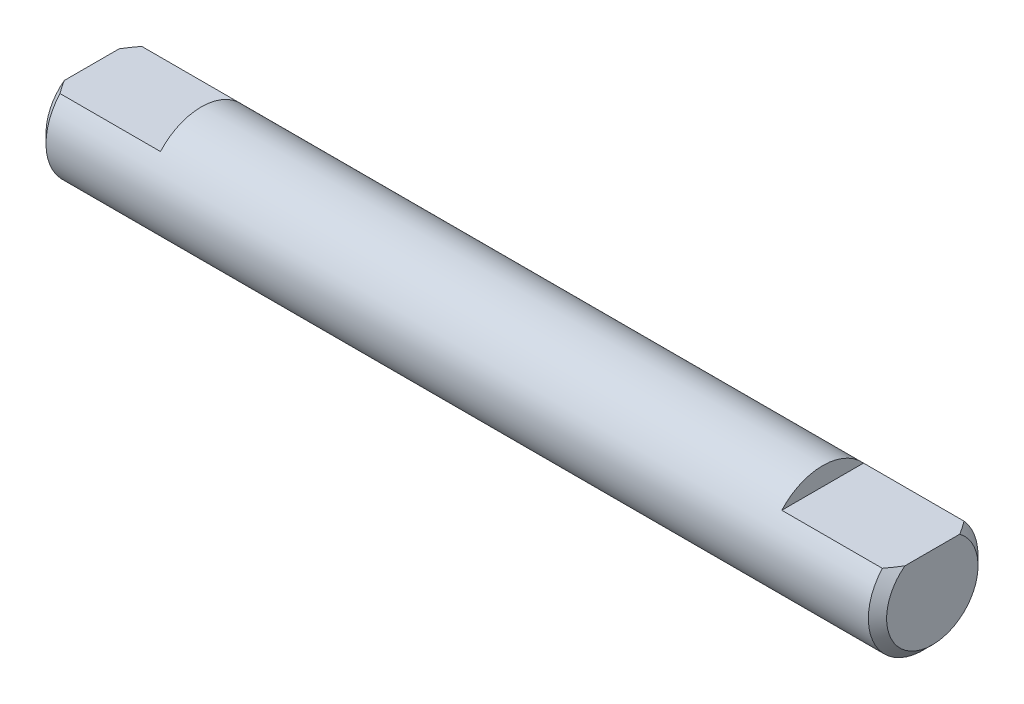
ISO-10303-21;
HEADER;
FILE_DESCRIPTION(('STEP AP214'),'2;1');
FILE_NAME('part.step','',(''),(''),'','','');
FILE_SCHEMA(('AUTOMOTIVE_DESIGN { 1 0 10303 214 1 1 1 1 }'));
ENDSEC;
DATA;
#1=APPLICATION_CONTEXT('core data for automotive mechanical design processes');
#2=APPLICATION_PROTOCOL_DEFINITION('international standard','automotive_design',2000,#1);
#3=PRODUCT_CONTEXT('',#1,'mechanical');
#4=PRODUCT('Part','Part','',(#3));
#5=PRODUCT_RELATED_PRODUCT_CATEGORY('part','',(#4));
#6=PRODUCT_DEFINITION_FORMATION('','',#4);
#7=PRODUCT_DEFINITION_CONTEXT('part definition',#1,'design');
#8=PRODUCT_DEFINITION('design','',#6,#7);
#9=PRODUCT_DEFINITION_SHAPE('','',#8);
#10=(LENGTH_UNIT() NAMED_UNIT(*) SI_UNIT(.MILLI.,.METRE.));
#11=(NAMED_UNIT(*) PLANE_ANGLE_UNIT() SI_UNIT($,.RADIAN.));
#12=(NAMED_UNIT(*) SI_UNIT($,.STERADIAN.) SOLID_ANGLE_UNIT());
#13=UNCERTAINTY_MEASURE_WITH_UNIT(LENGTH_MEASURE(1.E-05),#10,'distance_accuracy_value','');
#14=(GEOMETRIC_REPRESENTATION_CONTEXT(3) GLOBAL_UNCERTAINTY_ASSIGNED_CONTEXT((#13)) GLOBAL_UNIT_ASSIGNED_CONTEXT((#10,
#11,#12)) REPRESENTATION_CONTEXT('',''));
#15=CARTESIAN_POINT('',(0.,0.,0.));
#16=DIRECTION('',(0.,0.,1.));
#17=DIRECTION('',(1.,0.,0.));
#18=AXIS2_PLACEMENT_3D('',#15,#16,#17);
#19=CARTESIAN_POINT('',(23.,0.,0.));
#20=DIRECTION('',(-1.,0.,0.));
#21=DIRECTION('',(0.,0.,1.));
#22=AXIS2_PLACEMENT_3D('',#19,#20,#21);
#23=CYLINDRICAL_SURFACE('',#22,3.);
#24=CARTESIAN_POINT('',(22.5,0.,0.));
#25=DIRECTION('',(1.,0.,0.));
#26=DIRECTION('',(0.,0.,-1.));
#27=AXIS2_PLACEMENT_3D('',#24,#25,#26);
#28=CIRCLE('',#27,3.);
#29=CARTESIAN_POINT('',(22.5,2.,-2.23606797749979));
#30=VERTEX_POINT('',#29);
#31=CARTESIAN_POINT('',(22.5,2.,2.23606797749979));
#32=VERTEX_POINT('',#31);
#33=EDGE_CURVE('E119',#30,#32,#28,.F.);
#34=ORIENTED_EDGE('',*,*,#33,.T.);
#35=DIRECTION('',(1.,0.,0.));
#36=VECTOR('',#35,1.);
#37=CARTESIAN_POINT('',(17.,2.,2.23606797749979));
#38=LINE('',#37,#36);
#39=CARTESIAN_POINT('',(17.,2.,2.23606797749979));
#40=VERTEX_POINT('',#39);
#41=EDGE_CURVE('E114',#40,#32,#38,.T.);
#42=ORIENTED_EDGE('',*,*,#41,.F.);
#43=CARTESIAN_POINT('',(17.,0.,0.));
#44=DIRECTION('',(1.,0.,0.));
#45=DIRECTION('',(0.,0.,-1.));
#46=AXIS2_PLACEMENT_3D('',#43,#44,#45);
#47=CIRCLE('',#46,3.);
#48=CARTESIAN_POINT('',(17.,2.,-2.23606797749979));
#49=VERTEX_POINT('',#48);
#50=EDGE_CURVE('E109',#49,#40,#47,.T.);
#51=ORIENTED_EDGE('',*,*,#50,.F.);
#52=DIRECTION('',(1.,0.,0.));
#53=VECTOR('',#52,1.);
#54=CARTESIAN_POINT('',(17.,2.,-2.23606797749979));
#55=LINE('',#54,#53);
#56=EDGE_CURVE('E116',#49,#30,#55,.T.);
#57=ORIENTED_EDGE('',*,*,#56,.T.);
#58=EDGE_LOOP('',(#34,#42,#51,#57));
#59=FACE_BOUND('',#58,.T.);
#60=DIRECTION('',(-1.,0.,0.));
#61=VECTOR('',#60,1.);
#62=CARTESIAN_POINT('',(-17.,2.,-2.23606797749979));
#63=LINE('',#62,#61);
#64=CARTESIAN_POINT('',(-17.,2.,-2.23606797749979));
#65=VERTEX_POINT('',#64);
#66=CARTESIAN_POINT('',(-22.5,2.,-2.23606797749979));
#67=VERTEX_POINT('',#66);
#68=EDGE_CURVE('E53',#65,#67,#63,.T.);
#69=ORIENTED_EDGE('',*,*,#68,.F.);
#70=CARTESIAN_POINT('',(-17.,0.,0.));
#71=DIRECTION('',(1.,0.,0.));
#72=DIRECTION('',(0.,0.,-1.));
#73=AXIS2_PLACEMENT_3D('',#70,#71,#72);
#74=CIRCLE('',#73,3.);
#75=CARTESIAN_POINT('',(-17.,2.,2.23606797749979));
#76=VERTEX_POINT('',#75);
#77=EDGE_CURVE('E96',#65,#76,#74,.T.);
#78=ORIENTED_EDGE('',*,*,#77,.T.);
#79=DIRECTION('',(-1.,0.,0.));
#80=VECTOR('',#79,1.);
#81=CARTESIAN_POINT('',(-17.,2.,2.23606797749979));
#82=LINE('',#81,#80);
#83=CARTESIAN_POINT('',(-22.5,2.,2.23606797749979));
#84=VERTEX_POINT('',#83);
#85=EDGE_CURVE('E93',#76,#84,#82,.T.);
#86=ORIENTED_EDGE('',*,*,#85,.T.);
#87=CARTESIAN_POINT('',(-22.5,0.,0.));
#88=DIRECTION('',(1.,0.,0.));
#89=DIRECTION('',(0.,0.,-1.));
#90=AXIS2_PLACEMENT_3D('',#87,#88,#89);
#91=CIRCLE('',#90,3.);
#92=EDGE_CURVE('E104',#84,#67,#91,.T.);
#93=ORIENTED_EDGE('',*,*,#92,.T.);
#94=EDGE_LOOP('',(#69,#78,#86,#93));
#95=FACE_BOUND('',#94,.T.);
#96=ADVANCED_FACE('F33',(#59,#95),#23,.T.);
#97=CARTESIAN_POINT('',(-23.,0.,0.));
#98=DIRECTION('',(1.,0.,0.));
#99=DIRECTION('',(0.,0.,-1.));
#100=AXIS2_PLACEMENT_3D('',#97,#98,#99);
#101=PLANE('',#100);
#102=DIRECTION('',(0.,0.,-1.));
#103=VECTOR('',#102,1.);
#104=CARTESIAN_POINT('',(-23.,2.,2.23606797749979));
#105=LINE('',#104,#103);
#106=CARTESIAN_POINT('',(-23.,2.,1.49999999999999));
#107=VERTEX_POINT('',#106);
#108=CARTESIAN_POINT('',(-23.,2.,-1.49999999999999));
#109=VERTEX_POINT('',#108);
#110=EDGE_CURVE('E100',#107,#109,#105,.T.);
#111=ORIENTED_EDGE('',*,*,#110,.T.);
#112=CARTESIAN_POINT('',(-23.,0.,0.));
#113=DIRECTION('',(1.,0.,0.));
#114=DIRECTION('',(0.,0.,-1.));
#115=AXIS2_PLACEMENT_3D('',#112,#113,#114);
#116=CIRCLE('',#115,2.5);
#117=EDGE_CURVE('E124',#109,#107,#116,.F.);
#118=ORIENTED_EDGE('',*,*,#117,.T.);
#119=EDGE_LOOP('',(#111,#118));
#120=FACE_BOUND('',#119,.T.);
#121=ADVANCED_FACE('F146',(#120),#101,.F.);
#122=CARTESIAN_POINT('',(-22.5,0.,0.));
#123=DIRECTION('',(1.,0.,0.));
#124=DIRECTION('',(0.,0.,-1.));
#125=AXIS2_PLACEMENT_3D('',#122,#123,#124);
#126=CONICAL_SURFACE('',#125,3.,0.785398163397453);
#127=ORIENTED_EDGE('',*,*,#92,.F.);
#128=CARTESIAN_POINT('',(-20.1739562951765,2.,4.93626797749979));
#129=CARTESIAN_POINT('',(-20.3116263102323,2.,4.78768381124845));
#130=CARTESIAN_POINT('',(-20.4488688001703,2.,4.63869756596273));
#131=CARTESIAN_POINT('',(-20.7221404063521,2.,4.33955728207182));
#132=CARTESIAN_POINT('',(-20.8581692492664,2.,4.18940299398388));
#133=CARTESIAN_POINT('',(-21.1294043369861,2.,3.88672415849227));
#134=CARTESIAN_POINT('',(-21.2646007730296,2.,3.7341908006299));
#135=CARTESIAN_POINT('',(-21.5326839106298,2.,3.42713160304089));
#136=CARTESIAN_POINT('',(-21.6655708826726,2.,3.27260600039062));
#137=CARTESIAN_POINT('',(-21.9016416051834,2.,2.99210640438999));
#138=CARTESIAN_POINT('',(-22.0054251811024,2.,2.86663901089742));
#139=CARTESIAN_POINT('',(-22.2100672620052,2.,2.61328277643716));
#140=CARTESIAN_POINT('',(-22.3109250532625,2.,2.48539335700056));
#141=CARTESIAN_POINT('',(-22.5082990419047,2.,2.22650548443355));
#142=CARTESIAN_POINT('',(-22.6048202373963,2.,2.09551089088956));
#143=CARTESIAN_POINT('',(-22.7447671190917,2.,1.89566419584528));
#144=CARTESIAN_POINT('',(-22.7906025013962,2.,1.82850179908418));
#145=CARTESIAN_POINT('',(-22.8802458696183,2.,1.69284128038713));
#146=CARTESIAN_POINT('',(-22.9240540801268,2.,1.62434330762089));
#147=CARTESIAN_POINT('',(-23.0077568287426,2.,1.48797798387184));
#148=CARTESIAN_POINT('',(-23.0477316201661,2.,1.42016017631464));
#149=CARTESIAN_POINT('',(-23.124626643768,2.,1.28282423563598));
#150=CARTESIAN_POINT('',(-23.1615475696607,2.,1.21330649334523));
#151=CARTESIAN_POINT('',(-23.2314815211118,2.,1.0723402344437));
#152=CARTESIAN_POINT('',(-23.264496175163,2.,1.0008925377824));
#153=CARTESIAN_POINT('',(-23.3255401133741,2.,0.855927305144275));
#154=CARTESIAN_POINT('',(-23.3535707912893,2.,0.782410354510826));
#155=CARTESIAN_POINT('',(-23.4173281170312,2.,0.591196656014609));
#156=CARTESIAN_POINT('',(-23.44853668053,2.,0.471874440503045));
#157=CARTESIAN_POINT('',(-23.4798985537804,2.,0.290464949037768));
#158=CARTESIAN_POINT('',(-23.4877770901142,2.,0.229673626127379));
#159=CARTESIAN_POINT('',(-23.4980276880383,2.,0.107614500574354));
#160=CARTESIAN_POINT('',(-23.5004000751751,2.,0.0463467263164207));
#161=CARTESIAN_POINT('',(-23.4994876340507,2.,-0.0763197942470336));
#162=CARTESIAN_POINT('',(-23.4961865331302,2.,-0.13771841112713));
#163=CARTESIAN_POINT('',(-23.4840927327863,2.,-0.259968375583737));
#164=CARTESIAN_POINT('',(-23.4752996010043,2.,-0.32081967969059));
#165=CARTESIAN_POINT('',(-23.4526584972667,2.,-0.441758386957274));
#166=CARTESIAN_POINT('',(-23.4387947934545,2.,-0.501842803788246));
#167=CARTESIAN_POINT('',(-23.4066497947718,2.,-0.620801694696722));
#168=CARTESIAN_POINT('',(-23.3883682885415,2.,-0.679676110738205));
#169=CARTESIAN_POINT('',(-23.32353373849,2.,-0.867010178133715));
#170=CARTESIAN_POINT('',(-23.269655609127,2.,-0.992934833748156));
#171=CARTESIAN_POINT('',(-23.1498194583963,2.,-1.23892735531403));
#172=CARTESIAN_POINT('',(-23.0838370471123,2.,-1.35898276485906));
#173=CARTESIAN_POINT('',(-22.9431293700758,2.,-1.59585458502193));
#174=CARTESIAN_POINT('',(-22.8683039830242,2.,-1.71261073718885));
#175=CARTESIAN_POINT('',(-22.7133369591881,2.,-1.94233316376557));
#176=CARTESIAN_POINT('',(-22.6332002257383,2.,-2.05530279263013));
#177=CARTESIAN_POINT('',(-22.4584536139599,2.,-2.29310526083197));
#178=CARTESIAN_POINT('',(-22.3633231135208,2.,-2.41755314631461));
#179=CARTESIAN_POINT('',(-22.169770359034,2.,-2.66387185446493));
#180=CARTESIAN_POINT('',(-22.0713476398,2.,-2.78574230894004));
#181=CARTESIAN_POINT('',(-21.8720580954331,2.,-3.0276493524681));
#182=CARTESIAN_POINT('',(-21.7711891086712,2.,-3.14768415452679));
#183=CARTESIAN_POINT('',(-21.5677067244689,2.,-3.38626695152413));
#184=CARTESIAN_POINT('',(-21.4650932831408,2.,-3.50481490892545));
#185=CARTESIAN_POINT('',(-21.2645083359917,2.,-3.73393503767578));
#186=CARTESIAN_POINT('',(-21.1666110971079,2.,-3.84457235346526));
#187=CARTESIAN_POINT('',(-20.9698872405432,2.,-4.0650206650625));
#188=CARTESIAN_POINT('',(-20.8710606043089,2.,-4.17483164429524));
#189=CARTESIAN_POINT('',(-20.672861613006,2.,-4.39356418106757));
#190=CARTESIAN_POINT('',(-20.5734907230783,2.,-4.50248706778863));
#191=CARTESIAN_POINT('',(-20.3741449318645,2.,-4.71977019005837));
#192=CARTESIAN_POINT('',(-20.2741700570922,2.,-4.82813044992246));
#193=CARTESIAN_POINT('',(-20.1739562951765,2.,-4.93626797749979));
#194=B_SPLINE_CURVE_WITH_KNOTS('',3,(#128,#129,#130,#131,#132,#133,#134,#135,#136,#137,#138,
#139,#140,#141,#142,#143,#144,#145,#146,#147,#148,#149,#150,#151,#152,#153,#154,#155,#156,#157,
#158,#159,#160,#161,#162,#163,#164,#165,#166,#167,#168,#169,#170,#171,#172,#173,#174,#175,#176,
#177,#178,#179,#180,#181,#182,#183,#184,#185,#186,#187,#188,#189,#190,#191,#192,#193),
.UNSPECIFIED.,.F.,.F.,(4,2,2,2,2,2,2,2,2,2,2,2,2,2,2,2,2,2,2,2,2,2,2,2,2,2,2,2,2,2,2,2,4),(0.,
0.607683822515695,1.21550121371796,1.82695959733875,2.43834587720767,2.92679827952436,
3.41536885142092,3.90336106917609,4.14727001406463,4.39115187121073,4.62725676477006,
4.86330787673308,5.09926023157596,5.33514649886008,5.70350071953635,5.88718743593394,
6.07086329173091,6.25506684494244,6.4392849013503,6.6240794258677,6.80888279321206,
7.21864694206687,7.62924601323273,8.0450439730275,8.46046328332828,8.93031101628629,
9.40022542091197,9.87057139026387,10.3409292103109,10.7841162696073,11.2273121949651,
11.6696319276303,12.1119323824531),.UNSPECIFIED.);
#195=EDGE_CURVE('E11',#84,#107,#194,.T.);
#196=ORIENTED_EDGE('',*,*,#195,.T.);
#197=ORIENTED_EDGE('',*,*,#117,.F.);
#198=EDGE_CURVE('E38',#109,#67,#194,.T.);
#199=ORIENTED_EDGE('',*,*,#198,.T.);
#200=EDGE_LOOP('',(#127,#196,#197,#199));
#201=FACE_BOUND('',#200,.T.);
#202=ADVANCED_FACE('F144',(#201),#126,.T.);
#203=CARTESIAN_POINT('',(23.,0.,0.));
#204=DIRECTION('',(1.,0.,0.));
#205=DIRECTION('',(0.,0.,-1.));
#206=AXIS2_PLACEMENT_3D('',#203,#204,#205);
#207=PLANE('',#206);
#208=DIRECTION('',(0.,0.,-1.));
#209=VECTOR('',#208,1.);
#210=CARTESIAN_POINT('',(23.,2.,2.23606797749979));
#211=LINE('',#210,#209);
#212=CARTESIAN_POINT('',(23.,2.,1.49999999999999));
#213=VERTEX_POINT('',#212);
#214=CARTESIAN_POINT('',(23.,2.,-1.49999999999999));
#215=VERTEX_POINT('',#214);
#216=EDGE_CURVE('E61',#213,#215,#211,.T.);
#217=ORIENTED_EDGE('',*,*,#216,.F.);
#218=CARTESIAN_POINT('',(23.,0.,0.));
#219=DIRECTION('',(1.,0.,0.));
#220=DIRECTION('',(0.,0.,-1.));
#221=AXIS2_PLACEMENT_3D('',#218,#219,#220);
#222=CIRCLE('',#221,2.5);
#223=EDGE_CURVE('E127',#213,#215,#222,.T.);
#224=ORIENTED_EDGE('',*,*,#223,.T.);
#225=EDGE_LOOP('',(#217,#224));
#226=FACE_BOUND('',#225,.T.);
#227=ADVANCED_FACE('F141',(#226),#207,.T.);
#228=CARTESIAN_POINT('',(23.,0.,0.));
#229=DIRECTION('',(-1.,0.,0.));
#230=DIRECTION('',(0.,0.,1.));
#231=AXIS2_PLACEMENT_3D('',#228,#229,#230);
#232=CONICAL_SURFACE('',#231,2.5,0.785398163397453);
#233=CARTESIAN_POINT('',(20.1739562951765,2.,4.93626797749979));
#234=CARTESIAN_POINT('',(20.3116263102323,2.,4.78768381124845));
#235=CARTESIAN_POINT('',(20.4488688001703,2.,4.63869756596274));
#236=CARTESIAN_POINT('',(20.7221404063521,2.,4.33955728207182));
#237=CARTESIAN_POINT('',(20.8581692492664,2.,4.18940299398388));
#238=CARTESIAN_POINT('',(21.1294043369861,2.,3.88672415849227));
#239=CARTESIAN_POINT('',(21.2646007730296,2.,3.7341908006299));
#240=CARTESIAN_POINT('',(21.5326839106298,2.,3.42713160304089));
#241=CARTESIAN_POINT('',(21.6655708826726,2.,3.27260600039062));
#242=CARTESIAN_POINT('',(21.9016416051834,2.,2.99210640438998));
#243=CARTESIAN_POINT('',(22.0054251811024,2.,2.86663901089742));
#244=CARTESIAN_POINT('',(22.2100672620052,2.,2.61328277643715));
#245=CARTESIAN_POINT('',(22.3109250532625,2.,2.48539335700054));
#246=CARTESIAN_POINT('',(22.5082990419047,2.,2.22650548443353));
#247=CARTESIAN_POINT('',(22.6048202373963,2.,2.09551089088955));
#248=CARTESIAN_POINT('',(22.7447671190917,2.,1.89566419584526));
#249=CARTESIAN_POINT('',(22.7906025013962,2.,1.82850179908416));
#250=CARTESIAN_POINT('',(22.8802458696183,2.,1.69284128038711));
#251=CARTESIAN_POINT('',(22.9240540801269,2.,1.62434330762086));
#252=CARTESIAN_POINT('',(23.0077568287426,2.,1.48797798387182));
#253=CARTESIAN_POINT('',(23.0477316201661,2.,1.42016017631462));
#254=CARTESIAN_POINT('',(23.124626643768,2.,1.28282423563596));
#255=CARTESIAN_POINT('',(23.1615475696607,2.,1.21330649334521));
#256=CARTESIAN_POINT('',(23.2314815211118,2.,1.07234023444368));
#257=CARTESIAN_POINT('',(23.264496175163,2.,1.00089253778239));
#258=CARTESIAN_POINT('',(23.3255401133741,2.,0.855927305144259));
#259=CARTESIAN_POINT('',(23.3535707912893,2.,0.782410354510812));
#260=CARTESIAN_POINT('',(23.4173281170312,2.,0.591196656014596));
#261=CARTESIAN_POINT('',(23.44853668053,2.,0.471874440503033));
#262=CARTESIAN_POINT('',(23.4798985537804,2.,0.290464949037756));
#263=CARTESIAN_POINT('',(23.4877770901142,2.,0.229673626127367));
#264=CARTESIAN_POINT('',(23.4980276880383,2.,0.107614500574343));
#265=CARTESIAN_POINT('',(23.5004000751751,2.,0.046346726316409));
#266=CARTESIAN_POINT('',(23.4994876340507,2.,-0.0763197942470449));
#267=CARTESIAN_POINT('',(23.4961865331302,2.,-0.13771841112714));
#268=CARTESIAN_POINT('',(23.4840927327863,2.,-0.259968375583747));
#269=CARTESIAN_POINT('',(23.4752996010043,2.,-0.3208196796906));
#270=CARTESIAN_POINT('',(23.4526584972667,2.,-0.441758386957283));
#271=CARTESIAN_POINT('',(23.4387947934545,2.,-0.501842803788254));
#272=CARTESIAN_POINT('',(23.4066497947718,2.,-0.62080169469673));
#273=CARTESIAN_POINT('',(23.3883682885415,2.,-0.679676110738213));
#274=CARTESIAN_POINT('',(23.32353373849,2.,-0.867010178133724));
#275=CARTESIAN_POINT('',(23.269655609127,2.,-0.992934833748166));
#276=CARTESIAN_POINT('',(23.1498194583963,2.,-1.23892735531404));
#277=CARTESIAN_POINT('',(23.0838370471123,2.,-1.35898276485907));
#278=CARTESIAN_POINT('',(22.9431293700758,2.,-1.59585458502195));
#279=CARTESIAN_POINT('',(22.8683039830242,2.,-1.71261073718886));
#280=CARTESIAN_POINT('',(22.7133369591881,2.,-1.94233316376559));
#281=CARTESIAN_POINT('',(22.6332002257383,2.,-2.05530279263015));
#282=CARTESIAN_POINT('',(22.4584536139599,2.,-2.29310526083199));
#283=CARTESIAN_POINT('',(22.3633231135208,2.,-2.41755314631463));
#284=CARTESIAN_POINT('',(22.169770359034,2.,-2.66387185446495));
#285=CARTESIAN_POINT('',(22.0713476398,2.,-2.78574230894005));
#286=CARTESIAN_POINT('',(21.8720580954331,2.,-3.02764935246811));
#287=CARTESIAN_POINT('',(21.7711891086712,2.,-3.1476841545268));
#288=CARTESIAN_POINT('',(21.5677067244689,2.,-3.38626695152415));
#289=CARTESIAN_POINT('',(21.4650932831407,2.,-3.50481490892546));
#290=CARTESIAN_POINT('',(21.2645083359917,2.,-3.73393503767579));
#291=CARTESIAN_POINT('',(21.1666110971079,2.,-3.84457235346528));
#292=CARTESIAN_POINT('',(20.9698872405432,2.,-4.06502066506251));
#293=CARTESIAN_POINT('',(20.8710606043089,2.,-4.17483164429525));
#294=CARTESIAN_POINT('',(20.672861613006,2.,-4.39356418106757));
#295=CARTESIAN_POINT('',(20.5734907230783,2.,-4.50248706778863));
#296=CARTESIAN_POINT('',(20.3741449318645,2.,-4.71977019005837));
#297=CARTESIAN_POINT('',(20.2741700570922,2.,-4.82813044992246));
#298=CARTESIAN_POINT('',(20.1739562951765,2.,-4.93626797749979));
#299=B_SPLINE_CURVE_WITH_KNOTS('',3,(#233,#234,#235,#236,#237,#238,#239,#240,#241,#242,#243,
#244,#245,#246,#247,#248,#249,#250,#251,#252,#253,#254,#255,#256,#257,#258,#259,#260,#261,#262,
#263,#264,#265,#266,#267,#268,#269,#270,#271,#272,#273,#274,#275,#276,#277,#278,#279,#280,#281,
#282,#283,#284,#285,#286,#287,#288,#289,#290,#291,#292,#293,#294,#295,#296,#297,#298),
.UNSPECIFIED.,.F.,.F.,(4,2,2,2,2,2,2,2,2,2,2,2,2,2,2,2,2,2,2,2,2,2,2,2,2,2,2,2,2,2,2,2,4),(0.,
0.607683822515696,1.21550121371796,1.82695959733875,2.43834587720767,2.92679827952437,
3.41536885142094,3.90336106917612,4.14727001406466,4.39115187121076,4.62725676477008,
4.8633078767331,5.09926023157598,5.3351464988601,5.70350071953636,5.88718743593395,
6.07086329173092,6.25506684494245,6.43928490135031,6.62407942586771,6.80888279321207,
7.21864694206688,7.62924601323275,8.04504397302752,8.46046328332831,8.93031101628632,
9.40022542091199,9.87057139026389,10.3409292103109,10.7841162696073,11.2273121949651,
11.6696319276303,12.1119323824531),.UNSPECIFIED.);
#300=EDGE_CURVE('E134',#32,#213,#299,.T.);
#301=ORIENTED_EDGE('',*,*,#300,.F.);
#302=ORIENTED_EDGE('',*,*,#33,.F.);
#303=EDGE_CURVE('E129',#215,#30,#299,.T.);
#304=ORIENTED_EDGE('',*,*,#303,.F.);
#305=ORIENTED_EDGE('',*,*,#223,.F.);
#306=EDGE_LOOP('',(#301,#302,#304,#305));
#307=FACE_BOUND('',#306,.T.);
#308=ADVANCED_FACE('F35',(#307),#232,.T.);
#309=CARTESIAN_POINT('',(17.,2.,2.23606797749979));
#310=DIRECTION('',(0.,-1.,0.));
#311=DIRECTION('',(0.,0.,-1.));
#312=AXIS2_PLACEMENT_3D('',#309,#310,#311);
#313=PLANE('',#312);
#314=ORIENTED_EDGE('',*,*,#300,.T.);
#315=ORIENTED_EDGE('',*,*,#216,.T.);
#316=ORIENTED_EDGE('',*,*,#303,.T.);
#317=ORIENTED_EDGE('',*,*,#56,.F.);
#318=DIRECTION('',(0.,0.,-1.));
#319=VECTOR('',#318,1.);
#320=CARTESIAN_POINT('',(17.,2.,2.23606797749979));
#321=LINE('',#320,#319);
#322=EDGE_CURVE('E111',#40,#49,#321,.T.);
#323=ORIENTED_EDGE('',*,*,#322,.F.);
#324=ORIENTED_EDGE('',*,*,#41,.T.);
#325=EDGE_LOOP('',(#314,#315,#316,#317,#323,#324));
#326=FACE_BOUND('',#325,.T.);
#327=ADVANCED_FACE('F135',(#326),#313,.F.);
#328=CARTESIAN_POINT('',(17.,0.,0.));
#329=DIRECTION('',(1.,0.,0.));
#330=DIRECTION('',(0.,0.,-1.));
#331=AXIS2_PLACEMENT_3D('',#328,#329,#330);
#332=PLANE('',#331);
#333=ORIENTED_EDGE('',*,*,#50,.T.);
#334=ORIENTED_EDGE('',*,*,#322,.T.);
#335=EDGE_LOOP('',(#333,#334));
#336=FACE_BOUND('',#335,.T.);
#337=ADVANCED_FACE('F140',(#336),#332,.T.);
#338=CARTESIAN_POINT('',(-17.,2.,2.23606797749979));
#339=DIRECTION('',(0.,1.,0.));
#340=DIRECTION('',(0.,0.,1.));
#341=AXIS2_PLACEMENT_3D('',#338,#339,#340);
#342=PLANE('',#341);
#343=ORIENTED_EDGE('',*,*,#85,.F.);
#344=DIRECTION('',(0.,0.,-1.));
#345=VECTOR('',#344,1.);
#346=CARTESIAN_POINT('',(-17.,2.,2.23606797749979));
#347=LINE('',#346,#345);
#348=EDGE_CURVE('E89',#76,#65,#347,.T.);
#349=ORIENTED_EDGE('',*,*,#348,.T.);
#350=ORIENTED_EDGE('',*,*,#68,.T.);
#351=ORIENTED_EDGE('',*,*,#198,.F.);
#352=ORIENTED_EDGE('',*,*,#110,.F.);
#353=ORIENTED_EDGE('',*,*,#195,.F.);
#354=EDGE_LOOP('',(#343,#349,#350,#351,#352,#353));
#355=FACE_BOUND('',#354,.T.);
#356=ADVANCED_FACE('F91',(#355),#342,.T.);
#357=CARTESIAN_POINT('',(-17.,0.,0.));
#358=DIRECTION('',(-1.,0.,0.));
#359=DIRECTION('',(0.,0.,-1.));
#360=AXIS2_PLACEMENT_3D('',#357,#358,#359);
#361=PLANE('',#360);
#362=ORIENTED_EDGE('',*,*,#77,.F.);
#363=ORIENTED_EDGE('',*,*,#348,.F.);
#364=EDGE_LOOP('',(#362,#363));
#365=FACE_BOUND('',#364,.T.);
#366=ADVANCED_FACE('F98',(#365),#361,.T.);
#367=CLOSED_SHELL('',(#96,#121,#202,#227,#308,#327,#337,#356,#366));
#368=MANIFOLD_SOLID_BREP('B2',#367);
#369=ADVANCED_BREP_SHAPE_REPRESENTATION('',(#18,#368),#14);
#370=SHAPE_DEFINITION_REPRESENTATION(#9,#369);
ENDSEC;
END-ISO-10303-21;
